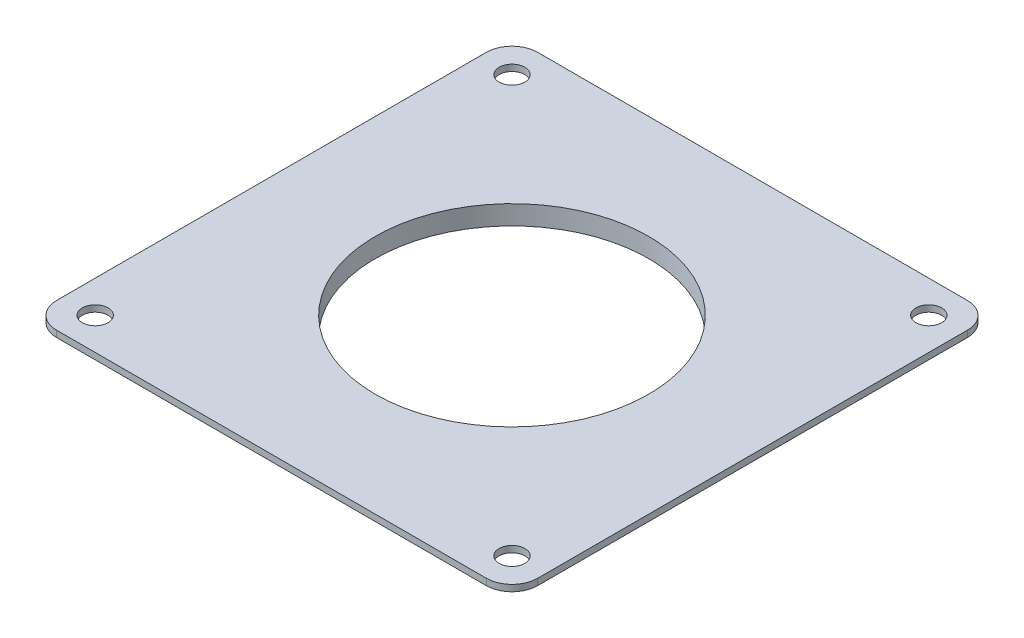
ISO-10303-21;
HEADER;
FILE_DESCRIPTION(('STEP AP214'),'2;1');
FILE_NAME('part.step','',(''),(''),'','','');
FILE_SCHEMA(('AUTOMOTIVE_DESIGN { 1 0 10303 214 1 1 1 1 }'));
ENDSEC;
DATA;
#1=APPLICATION_CONTEXT('core data for automotive mechanical design processes');
#2=APPLICATION_PROTOCOL_DEFINITION('international standard','automotive_design',2000,#1);
#3=PRODUCT_CONTEXT('',#1,'mechanical');
#4=PRODUCT('Part','Part','',(#3));
#5=PRODUCT_RELATED_PRODUCT_CATEGORY('part','',(#4));
#6=PRODUCT_DEFINITION_FORMATION('','',#4);
#7=PRODUCT_DEFINITION_CONTEXT('part definition',#1,'design');
#8=PRODUCT_DEFINITION('design','',#6,#7);
#9=PRODUCT_DEFINITION_SHAPE('','',#8);
#10=(LENGTH_UNIT() NAMED_UNIT(*) SI_UNIT(.MILLI.,.METRE.));
#11=(NAMED_UNIT(*) PLANE_ANGLE_UNIT() SI_UNIT($,.RADIAN.));
#12=(NAMED_UNIT(*) SI_UNIT($,.STERADIAN.) SOLID_ANGLE_UNIT());
#13=UNCERTAINTY_MEASURE_WITH_UNIT(LENGTH_MEASURE(1.E-05),#10,'distance_accuracy_value','');
#14=(GEOMETRIC_REPRESENTATION_CONTEXT(3) GLOBAL_UNCERTAINTY_ASSIGNED_CONTEXT((#13)) GLOBAL_UNIT_ASSIGNED_CONTEXT((#10,
#11,#12)) REPRESENTATION_CONTEXT('',''));
#15=CARTESIAN_POINT('',(0.,0.,0.));
#16=DIRECTION('',(0.,0.,1.));
#17=DIRECTION('',(1.,0.,0.));
#18=AXIS2_PLACEMENT_3D('',#15,#16,#17);
#19=CARTESIAN_POINT('',(-42.42,1.27,42.42));
#20=DIRECTION('',(0.,-1.,0.));
#21=DIRECTION('',(0.,0.,-1.));
#22=AXIS2_PLACEMENT_3D('',#19,#20,#21);
#23=CYLINDRICAL_SURFACE('',#22,5.08);
#24=CARTESIAN_POINT('',(-42.42,0.,42.42));
#25=DIRECTION('',(0.,1.,0.));
#26=DIRECTION('',(0.,0.,-1.));
#27=AXIS2_PLACEMENT_3D('',#24,#25,#26);
#28=CIRCLE('',#27,5.08);
#29=CARTESIAN_POINT('',(-47.5,0.,42.42));
#30=VERTEX_POINT('',#29);
#31=CARTESIAN_POINT('',(-42.42,0.,47.5));
#32=VERTEX_POINT('',#31);
#33=EDGE_CURVE('E150',#30,#32,#28,.T.);
#34=ORIENTED_EDGE('',*,*,#33,.T.);
#35=DIRECTION('',(0.,-1.,0.));
#36=VECTOR('',#35,1.);
#37=CARTESIAN_POINT('',(-42.42,1.27,47.5));
#38=LINE('',#37,#36);
#39=CARTESIAN_POINT('',(-42.42,1.27,47.5));
#40=VERTEX_POINT('',#39);
#41=EDGE_CURVE('E56',#40,#32,#38,.T.);
#42=ORIENTED_EDGE('',*,*,#41,.F.);
#43=CARTESIAN_POINT('',(-42.42,1.27,42.42));
#44=DIRECTION('',(0.,1.,0.));
#45=DIRECTION('',(0.,0.,-1.));
#46=AXIS2_PLACEMENT_3D('',#43,#44,#45);
#47=CIRCLE('',#46,5.08);
#48=CARTESIAN_POINT('',(-47.5,1.27,42.42));
#49=VERTEX_POINT('',#48);
#50=EDGE_CURVE('E173',#49,#40,#47,.T.);
#51=ORIENTED_EDGE('',*,*,#50,.F.);
#52=DIRECTION('',(0.,-1.,0.));
#53=VECTOR('',#52,1.);
#54=CARTESIAN_POINT('',(-47.5,1.27,42.42));
#55=LINE('',#54,#53);
#56=EDGE_CURVE('E146',#49,#30,#55,.T.);
#57=ORIENTED_EDGE('',*,*,#56,.T.);
#58=EDGE_LOOP('',(#34,#42,#51,#57));
#59=FACE_BOUND('',#58,.T.);
#60=ADVANCED_FACE('F45',(#59),#23,.T.);
#61=CARTESIAN_POINT('',(-42.42,1.27,47.5));
#62=DIRECTION('',(0.,0.,-1.));
#63=DIRECTION('',(-1.,0.,0.));
#64=AXIS2_PLACEMENT_3D('',#61,#62,#63);
#65=PLANE('',#64);
#66=DIRECTION('',(1.,0.,0.));
#67=VECTOR('',#66,1.);
#68=CARTESIAN_POINT('',(-42.42,0.,47.5));
#69=LINE('',#68,#67);
#70=CARTESIAN_POINT('',(42.42,0.,47.5));
#71=VERTEX_POINT('',#70);
#72=EDGE_CURVE('E154',#32,#71,#69,.T.);
#73=ORIENTED_EDGE('',*,*,#72,.T.);
#74=DIRECTION('',(0.,-1.,0.));
#75=VECTOR('',#74,1.);
#76=CARTESIAN_POINT('',(42.42,1.27,47.5));
#77=LINE('',#76,#75);
#78=CARTESIAN_POINT('',(42.42,1.27,47.5));
#79=VERTEX_POINT('',#78);
#80=EDGE_CURVE('E188',#79,#71,#77,.T.);
#81=ORIENTED_EDGE('',*,*,#80,.F.);
#82=DIRECTION('',(1.,0.,0.));
#83=VECTOR('',#82,1.);
#84=CARTESIAN_POINT('',(-42.42,1.27,47.5));
#85=LINE('',#84,#83);
#86=EDGE_CURVE('E109',#40,#79,#85,.T.);
#87=ORIENTED_EDGE('',*,*,#86,.F.);
#88=ORIENTED_EDGE('',*,*,#41,.T.);
#89=EDGE_LOOP('',(#73,#81,#87,#88));
#90=FACE_BOUND('',#89,.T.);
#91=ADVANCED_FACE('F266',(#90),#65,.F.);
#92=CARTESIAN_POINT('',(42.42,1.27,42.42));
#93=DIRECTION('',(0.,-1.,0.));
#94=DIRECTION('',(0.,0.,-1.));
#95=AXIS2_PLACEMENT_3D('',#92,#93,#94);
#96=CYLINDRICAL_SURFACE('',#95,5.08);
#97=CARTESIAN_POINT('',(42.42,0.,42.42));
#98=DIRECTION('',(0.,1.,0.));
#99=DIRECTION('',(0.,0.,1.));
#100=AXIS2_PLACEMENT_3D('',#97,#98,#99);
#101=CIRCLE('',#100,5.08);
#102=CARTESIAN_POINT('',(47.5,0.,42.42));
#103=VERTEX_POINT('',#102);
#104=EDGE_CURVE('E158',#71,#103,#101,.T.);
#105=ORIENTED_EDGE('',*,*,#104,.T.);
#106=DIRECTION('',(0.,-1.,0.));
#107=VECTOR('',#106,1.);
#108=CARTESIAN_POINT('',(47.5,1.27,42.42));
#109=LINE('',#108,#107);
#110=CARTESIAN_POINT('',(47.5,1.27,42.42));
#111=VERTEX_POINT('',#110);
#112=EDGE_CURVE('E184',#111,#103,#109,.T.);
#113=ORIENTED_EDGE('',*,*,#112,.F.);
#114=CARTESIAN_POINT('',(42.42,1.27,42.42));
#115=DIRECTION('',(0.,1.,0.));
#116=DIRECTION('',(0.,0.,1.));
#117=AXIS2_PLACEMENT_3D('',#114,#115,#116);
#118=CIRCLE('',#117,5.08);
#119=EDGE_CURVE('E230',#79,#111,#118,.T.);
#120=ORIENTED_EDGE('',*,*,#119,.F.);
#121=ORIENTED_EDGE('',*,*,#80,.T.);
#122=EDGE_LOOP('',(#105,#113,#120,#121));
#123=FACE_BOUND('',#122,.T.);
#124=ADVANCED_FACE('F270',(#123),#96,.T.);
#125=CARTESIAN_POINT('',(47.5,1.27,42.42));
#126=DIRECTION('',(-1.,0.,0.));
#127=DIRECTION('',(0.,0.,1.));
#128=AXIS2_PLACEMENT_3D('',#125,#126,#127);
#129=PLANE('',#128);
#130=DIRECTION('',(0.,0.,-1.));
#131=VECTOR('',#130,1.);
#132=CARTESIAN_POINT('',(47.5,0.,42.42));
#133=LINE('',#132,#131);
#134=CARTESIAN_POINT('',(47.5,0.,-42.42));
#135=VERTEX_POINT('',#134);
#136=EDGE_CURVE('E161',#103,#135,#133,.T.);
#137=ORIENTED_EDGE('',*,*,#136,.T.);
#138=DIRECTION('',(0.,-1.,0.));
#139=VECTOR('',#138,1.);
#140=CARTESIAN_POINT('',(47.5,1.27,-42.42));
#141=LINE('',#140,#139);
#142=CARTESIAN_POINT('',(47.5,1.27,-42.42));
#143=VERTEX_POINT('',#142);
#144=EDGE_CURVE('E180',#143,#135,#141,.T.);
#145=ORIENTED_EDGE('',*,*,#144,.F.);
#146=DIRECTION('',(0.,0.,-1.));
#147=VECTOR('',#146,1.);
#148=CARTESIAN_POINT('',(47.5,1.27,42.42));
#149=LINE('',#148,#147);
#150=EDGE_CURVE('E233',#111,#143,#149,.T.);
#151=ORIENTED_EDGE('',*,*,#150,.F.);
#152=ORIENTED_EDGE('',*,*,#112,.T.);
#153=EDGE_LOOP('',(#137,#145,#151,#152));
#154=FACE_BOUND('',#153,.T.);
#155=ADVANCED_FACE('F241',(#154),#129,.F.);
#156=CARTESIAN_POINT('',(42.42,1.27,-42.42));
#157=DIRECTION('',(0.,-1.,0.));
#158=DIRECTION('',(0.,0.,-1.));
#159=AXIS2_PLACEMENT_3D('',#156,#157,#158);
#160=CYLINDRICAL_SURFACE('',#159,5.08);
#161=CARTESIAN_POINT('',(42.42,0.,-42.42));
#162=DIRECTION('',(0.,1.,0.));
#163=DIRECTION('',(0.,0.,-1.));
#164=AXIS2_PLACEMENT_3D('',#161,#162,#163);
#165=CIRCLE('',#164,5.08);
#166=CARTESIAN_POINT('',(42.42,0.,-47.5));
#167=VERTEX_POINT('',#166);
#168=EDGE_CURVE('E164',#135,#167,#165,.T.);
#169=ORIENTED_EDGE('',*,*,#168,.T.);
#170=DIRECTION('',(0.,-1.,0.));
#171=VECTOR('',#170,1.);
#172=CARTESIAN_POINT('',(42.42,1.27,-47.5));
#173=LINE('',#172,#171);
#174=CARTESIAN_POINT('',(42.42,1.27,-47.5));
#175=VERTEX_POINT('',#174);
#176=EDGE_CURVE('E139',#175,#167,#173,.T.);
#177=ORIENTED_EDGE('',*,*,#176,.F.);
#178=CARTESIAN_POINT('',(42.42,1.27,-42.42));
#179=DIRECTION('',(0.,1.,0.));
#180=DIRECTION('',(0.,0.,-1.));
#181=AXIS2_PLACEMENT_3D('',#178,#179,#180);
#182=CIRCLE('',#181,5.08);
#183=EDGE_CURVE('E128',#143,#175,#182,.T.);
#184=ORIENTED_EDGE('',*,*,#183,.F.);
#185=ORIENTED_EDGE('',*,*,#144,.T.);
#186=EDGE_LOOP('',(#169,#177,#184,#185));
#187=FACE_BOUND('',#186,.T.);
#188=ADVANCED_FACE('F245',(#187),#160,.T.);
#189=CARTESIAN_POINT('',(-42.42,1.27,-47.5));
#190=DIRECTION('',(0.,0.,1.));
#191=DIRECTION('',(1.,0.,0.));
#192=AXIS2_PLACEMENT_3D('',#189,#190,#191);
#193=PLANE('',#192);
#194=DIRECTION('',(-1.,0.,0.));
#195=VECTOR('',#194,1.);
#196=CARTESIAN_POINT('',(-42.42,0.,-47.5));
#197=LINE('',#196,#195);
#198=CARTESIAN_POINT('',(-42.42,0.,-47.5));
#199=VERTEX_POINT('',#198);
#200=EDGE_CURVE('E137',#167,#199,#197,.T.);
#201=ORIENTED_EDGE('',*,*,#200,.T.);
#202=DIRECTION('',(0.,-1.,0.));
#203=VECTOR('',#202,1.);
#204=CARTESIAN_POINT('',(-42.42,1.27,-47.5));
#205=LINE('',#204,#203);
#206=CARTESIAN_POINT('',(-42.42,1.27,-47.5));
#207=VERTEX_POINT('',#206);
#208=EDGE_CURVE('E134',#207,#199,#205,.T.);
#209=ORIENTED_EDGE('',*,*,#208,.F.);
#210=DIRECTION('',(-1.,0.,0.));
#211=VECTOR('',#210,1.);
#212=CARTESIAN_POINT('',(-42.42,1.27,-47.5));
#213=LINE('',#212,#211);
#214=EDGE_CURVE('E122',#175,#207,#213,.T.);
#215=ORIENTED_EDGE('',*,*,#214,.F.);
#216=ORIENTED_EDGE('',*,*,#176,.T.);
#217=EDGE_LOOP('',(#201,#209,#215,#216));
#218=FACE_BOUND('',#217,.T.);
#219=ADVANCED_FACE('F135',(#218),#193,.F.);
#220=CARTESIAN_POINT('',(-42.42,1.27,-42.42));
#221=DIRECTION('',(0.,-1.,0.));
#222=DIRECTION('',(0.,0.,-1.));
#223=AXIS2_PLACEMENT_3D('',#220,#221,#222);
#224=CYLINDRICAL_SURFACE('',#223,5.08);
#225=CARTESIAN_POINT('',(-42.42,0.,-42.42));
#226=DIRECTION('',(0.,1.,0.));
#227=DIRECTION('',(0.,0.,-1.));
#228=AXIS2_PLACEMENT_3D('',#225,#226,#227);
#229=CIRCLE('',#228,5.08);
#230=CARTESIAN_POINT('',(-47.5,0.,-42.42));
#231=VERTEX_POINT('',#230);
#232=EDGE_CURVE('E94',#199,#231,#229,.T.);
#233=ORIENTED_EDGE('',*,*,#232,.T.);
#234=DIRECTION('',(0.,-1.,0.));
#235=VECTOR('',#234,1.);
#236=CARTESIAN_POINT('',(-47.5,1.27,-42.42));
#237=LINE('',#236,#235);
#238=CARTESIAN_POINT('',(-47.5,1.27,-42.42));
#239=VERTEX_POINT('',#238);
#240=EDGE_CURVE('E140',#239,#231,#237,.T.);
#241=ORIENTED_EDGE('',*,*,#240,.F.);
#242=CARTESIAN_POINT('',(-42.42,1.27,-42.42));
#243=DIRECTION('',(0.,1.,0.));
#244=DIRECTION('',(0.,0.,-1.));
#245=AXIS2_PLACEMENT_3D('',#242,#243,#244);
#246=CIRCLE('',#245,5.08);
#247=EDGE_CURVE('E126',#207,#239,#246,.T.);
#248=ORIENTED_EDGE('',*,*,#247,.F.);
#249=ORIENTED_EDGE('',*,*,#208,.T.);
#250=EDGE_LOOP('',(#233,#241,#248,#249));
#251=FACE_BOUND('',#250,.T.);
#252=ADVANCED_FACE('F142',(#251),#224,.T.);
#253=CARTESIAN_POINT('',(-47.5,1.27,42.42));
#254=DIRECTION('',(1.,0.,0.));
#255=DIRECTION('',(0.,0.,-1.));
#256=AXIS2_PLACEMENT_3D('',#253,#254,#255);
#257=PLANE('',#256);
#258=DIRECTION('',(0.,0.,1.));
#259=VECTOR('',#258,1.);
#260=CARTESIAN_POINT('',(-47.5,0.,42.42));
#261=LINE('',#260,#259);
#262=EDGE_CURVE('E100',#231,#30,#261,.T.);
#263=ORIENTED_EDGE('',*,*,#262,.T.);
#264=ORIENTED_EDGE('',*,*,#56,.F.);
#265=DIRECTION('',(0.,0.,1.));
#266=VECTOR('',#265,1.);
#267=CARTESIAN_POINT('',(-47.5,1.27,42.42));
#268=LINE('',#267,#266);
#269=EDGE_CURVE('E65',#239,#49,#268,.T.);
#270=ORIENTED_EDGE('',*,*,#269,.F.);
#271=ORIENTED_EDGE('',*,*,#240,.T.);
#272=EDGE_LOOP('',(#263,#264,#270,#271));
#273=FACE_BOUND('',#272,.T.);
#274=ADVANCED_FACE('F253',(#273),#257,.F.);
#275=CARTESIAN_POINT('',(-42.42,1.27,42.42));
#276=DIRECTION('',(0.,-1.,0.));
#277=DIRECTION('',(0.,0.,-1.));
#278=AXIS2_PLACEMENT_3D('',#275,#276,#277);
#279=PLANE('',#278);
#280=CARTESIAN_POINT('',(41.15,1.27,-41.15));
#281=DIRECTION('',(0.,1.,0.));
#282=DIRECTION('',(0.,0.,-1.));
#283=AXIS2_PLACEMENT_3D('',#280,#281,#282);
#284=CIRCLE('',#283,2.54);
#285=CARTESIAN_POINT('',(41.15,1.27,-43.69));
#286=VERTEX_POINT('',#285);
#287=EDGE_CURVE('E380',#286,#286,#284,.T.);
#288=ORIENTED_EDGE('',*,*,#287,.F.);
#289=EDGE_LOOP('',(#288));
#290=FACE_BOUND('',#289,.T.);
#291=CARTESIAN_POINT('',(-41.15,1.27,41.15));
#292=DIRECTION('',(0.,1.,0.));
#293=DIRECTION('',(0.,0.,-1.));
#294=AXIS2_PLACEMENT_3D('',#291,#292,#293);
#295=CIRCLE('',#294,2.54);
#296=CARTESIAN_POINT('',(-41.15,1.27,38.61));
#297=VERTEX_POINT('',#296);
#298=EDGE_CURVE('E382',#297,#297,#295,.T.);
#299=ORIENTED_EDGE('',*,*,#298,.F.);
#300=EDGE_LOOP('',(#299));
#301=FACE_BOUND('',#300,.T.);
#302=CARTESIAN_POINT('',(41.15,1.27,41.15));
#303=DIRECTION('',(0.,1.,0.));
#304=DIRECTION('',(0.,0.,1.));
#305=AXIS2_PLACEMENT_3D('',#302,#303,#304);
#306=CIRCLE('',#305,2.54);
#307=CARTESIAN_POINT('',(41.15,1.27,43.69));
#308=VERTEX_POINT('',#307);
#309=EDGE_CURVE('E388',#308,#308,#306,.T.);
#310=ORIENTED_EDGE('',*,*,#309,.F.);
#311=EDGE_LOOP('',(#310));
#312=FACE_BOUND('',#311,.T.);
#313=CARTESIAN_POINT('',(-41.15,1.27,-41.15));
#314=DIRECTION('',(0.,1.,0.));
#315=DIRECTION('',(0.,0.,1.));
#316=AXIS2_PLACEMENT_3D('',#313,#314,#315);
#317=CIRCLE('',#316,2.54);
#318=CARTESIAN_POINT('',(-41.15,1.27,-38.61));
#319=VERTEX_POINT('',#318);
#320=EDGE_CURVE('E199',#319,#319,#317,.T.);
#321=ORIENTED_EDGE('',*,*,#320,.F.);
#322=EDGE_LOOP('',(#321));
#323=FACE_BOUND('',#322,.T.);
#324=CARTESIAN_POINT('',(0.,1.27,0.));
#325=DIRECTION('',(0.,1.,0.));
#326=DIRECTION('',(0.,0.,1.));
#327=AXIS2_PLACEMENT_3D('',#324,#325,#326);
#328=CIRCLE('',#327,27.);
#329=CARTESIAN_POINT('',(0.,1.27,27.));
#330=VERTEX_POINT('',#329);
#331=EDGE_CURVE('E209',#330,#330,#328,.T.);
#332=ORIENTED_EDGE('',*,*,#331,.F.);
#333=EDGE_LOOP('',(#332));
#334=FACE_BOUND('',#333,.T.);
#335=ORIENTED_EDGE('',*,*,#50,.T.);
#336=ORIENTED_EDGE('',*,*,#86,.T.);
#337=ORIENTED_EDGE('',*,*,#119,.T.);
#338=ORIENTED_EDGE('',*,*,#150,.T.);
#339=ORIENTED_EDGE('',*,*,#183,.T.);
#340=ORIENTED_EDGE('',*,*,#214,.T.);
#341=ORIENTED_EDGE('',*,*,#247,.T.);
#342=ORIENTED_EDGE('',*,*,#269,.T.);
#343=EDGE_LOOP('',(#335,#336,#337,#338,#339,#340,#341,#342));
#344=FACE_BOUND('',#343,.T.);
#345=ADVANCED_FACE('F124',(#290,#301,#312,#323,#334,#344),#279,.F.);
#346=CARTESIAN_POINT('',(-42.42,0.,42.42));
#347=DIRECTION('',(0.,-1.,0.));
#348=DIRECTION('',(0.,0.,-1.));
#349=AXIS2_PLACEMENT_3D('',#346,#347,#348);
#350=PLANE('',#349);
#351=CARTESIAN_POINT('',(41.15,0.,-41.15));
#352=DIRECTION('',(0.,-1.,0.));
#353=DIRECTION('',(0.,0.,-1.));
#354=AXIS2_PLACEMENT_3D('',#351,#352,#353);
#355=CIRCLE('',#354,2.54);
#356=CARTESIAN_POINT('',(41.15,0.,-43.69));
#357=VERTEX_POINT('',#356);
#358=EDGE_CURVE('E49',#357,#357,#355,.T.);
#359=ORIENTED_EDGE('',*,*,#358,.F.);
#360=EDGE_LOOP('',(#359));
#361=FACE_BOUND('',#360,.T.);
#362=CARTESIAN_POINT('',(-41.15,0.,41.15));
#363=DIRECTION('',(0.,-1.,0.));
#364=DIRECTION('',(0.,0.,-1.));
#365=AXIS2_PLACEMENT_3D('',#362,#363,#364);
#366=CIRCLE('',#365,2.54);
#367=CARTESIAN_POINT('',(-41.15,0.,38.61));
#368=VERTEX_POINT('',#367);
#369=EDGE_CURVE('E202',#368,#368,#366,.T.);
#370=ORIENTED_EDGE('',*,*,#369,.F.);
#371=EDGE_LOOP('',(#370));
#372=FACE_BOUND('',#371,.T.);
#373=CARTESIAN_POINT('',(41.15,0.,41.15));
#374=DIRECTION('',(0.,-1.,0.));
#375=DIRECTION('',(0.,0.,-1.));
#376=AXIS2_PLACEMENT_3D('',#373,#374,#375);
#377=CIRCLE('',#376,2.54);
#378=CARTESIAN_POINT('',(41.15,0.,38.61));
#379=VERTEX_POINT('',#378);
#380=EDGE_CURVE('E198',#379,#379,#377,.T.);
#381=ORIENTED_EDGE('',*,*,#380,.F.);
#382=EDGE_LOOP('',(#381));
#383=FACE_BOUND('',#382,.T.);
#384=CARTESIAN_POINT('',(-41.15,0.,-41.15));
#385=DIRECTION('',(0.,-1.,0.));
#386=DIRECTION('',(0.,0.,-1.));
#387=AXIS2_PLACEMENT_3D('',#384,#385,#386);
#388=CIRCLE('',#387,2.54);
#389=CARTESIAN_POINT('',(-41.15,0.,-43.69));
#390=VERTEX_POINT('',#389);
#391=EDGE_CURVE('E194',#390,#390,#388,.T.);
#392=ORIENTED_EDGE('',*,*,#391,.F.);
#393=EDGE_LOOP('',(#392));
#394=FACE_BOUND('',#393,.T.);
#395=CARTESIAN_POINT('',(0.,0.,0.));
#396=DIRECTION('',(0.,-1.,0.));
#397=DIRECTION('',(0.,0.,-1.));
#398=AXIS2_PLACEMENT_3D('',#395,#396,#397);
#399=CIRCLE('',#398,44.8202083301041);
#400=CARTESIAN_POINT('',(0.,0.,-44.8202083301041));
#401=VERTEX_POINT('',#400);
#402=EDGE_CURVE('E11',#401,#401,#399,.F.);
#403=ORIENTED_EDGE('',*,*,#402,.T.);
#404=EDGE_LOOP('',(#403));
#405=FACE_BOUND('',#404,.T.);
#406=ORIENTED_EDGE('',*,*,#33,.F.);
#407=ORIENTED_EDGE('',*,*,#262,.F.);
#408=ORIENTED_EDGE('',*,*,#232,.F.);
#409=ORIENTED_EDGE('',*,*,#200,.F.);
#410=ORIENTED_EDGE('',*,*,#168,.F.);
#411=ORIENTED_EDGE('',*,*,#136,.F.);
#412=ORIENTED_EDGE('',*,*,#104,.F.);
#413=ORIENTED_EDGE('',*,*,#72,.F.);
#414=EDGE_LOOP('',(#406,#407,#408,#409,#410,#411,#412,#413));
#415=FACE_BOUND('',#414,.T.);
#416=ADVANCED_FACE('F248',(#361,#372,#383,#394,#405,#415),#350,.T.);
#417=CARTESIAN_POINT('',(0.,-2.54,0.));
#418=DIRECTION('',(0.,-1.,0.));
#419=DIRECTION('',(0.,0.,-1.));
#420=AXIS2_PLACEMENT_3D('',#417,#418,#419);
#421=PLANE('',#420);
#422=CARTESIAN_POINT('',(0.,-2.54,0.));
#423=DIRECTION('',(0.,1.,0.));
#424=DIRECTION('',(0.,0.,1.));
#425=AXIS2_PLACEMENT_3D('',#422,#423,#424);
#426=CIRCLE('',#425,27.);
#427=CARTESIAN_POINT('',(0.,-2.54,27.));
#428=VERTEX_POINT('',#427);
#429=EDGE_CURVE('E214',#428,#428,#426,.T.);
#430=ORIENTED_EDGE('',*,*,#429,.T.);
#431=EDGE_LOOP('',(#430));
#432=FACE_BOUND('',#431,.T.);
#433=CARTESIAN_POINT('',(0.,-2.54,0.));
#434=DIRECTION('',(0.,-1.,0.));
#435=DIRECTION('',(0.,0.,-1.));
#436=AXIS2_PLACEMENT_3D('',#433,#434,#435);
#437=CIRCLE('',#436,38.1);
#438=CARTESIAN_POINT('',(0.,-2.54,-38.1));
#439=VERTEX_POINT('',#438);
#440=EDGE_CURVE('E155',#439,#439,#437,.T.);
#441=ORIENTED_EDGE('',*,*,#440,.T.);
#442=EDGE_LOOP('',(#441));
#443=FACE_BOUND('',#442,.T.);
#444=ADVANCED_FACE('F311',(#432,#443),#421,.T.);
#445=CARTESIAN_POINT('',(0.,-10.16,0.));
#446=DIRECTION('',(0.,-1.,0.));
#447=DIRECTION('',(0.,0.,-1.));
#448=AXIS2_PLACEMENT_3D('',#445,#446,#447);
#449=TOROIDAL_SURFACE('',#448,44.8202083301041,10.16);
#450=ORIENTED_EDGE('',*,*,#402,.F.);
#451=EDGE_LOOP('',(#450));
#452=FACE_BOUND('',#451,.T.);
#453=ORIENTED_EDGE('',*,*,#440,.F.);
#454=EDGE_LOOP('',(#453));
#455=FACE_BOUND('',#454,.T.);
#456=ADVANCED_FACE('F47',(#452,#455),#449,.F.);
#457=CARTESIAN_POINT('',(0.,-2.54,0.));
#458=DIRECTION('',(0.,1.,0.));
#459=DIRECTION('',(0.,0.,1.));
#460=AXIS2_PLACEMENT_3D('',#457,#458,#459);
#461=CYLINDRICAL_SURFACE('',#460,27.);
#462=ORIENTED_EDGE('',*,*,#429,.F.);
#463=EDGE_LOOP('',(#462));
#464=FACE_BOUND('',#463,.T.);
#465=ORIENTED_EDGE('',*,*,#331,.T.);
#466=EDGE_LOOP('',(#465));
#467=FACE_BOUND('',#466,.T.);
#468=ADVANCED_FACE('F329',(#464,#467),#461,.F.);
#469=CARTESIAN_POINT('',(-41.15,-2.54,-41.15));
#470=DIRECTION('',(0.,1.,0.));
#471=DIRECTION('',(0.,0.,1.));
#472=AXIS2_PLACEMENT_3D('',#469,#470,#471);
#473=CYLINDRICAL_SURFACE('',#472,2.54);
#474=ORIENTED_EDGE('',*,*,#391,.T.);
#475=EDGE_LOOP('',(#474));
#476=FACE_BOUND('',#475,.T.);
#477=ORIENTED_EDGE('',*,*,#320,.T.);
#478=EDGE_LOOP('',(#477));
#479=FACE_BOUND('',#478,.T.);
#480=ADVANCED_FACE('F337',(#476,#479),#473,.F.);
#481=CARTESIAN_POINT('',(41.15,-2.54,41.15));
#482=DIRECTION('',(0.,1.,0.));
#483=DIRECTION('',(0.,0.,1.));
#484=AXIS2_PLACEMENT_3D('',#481,#482,#483);
#485=CYLINDRICAL_SURFACE('',#484,2.54);
#486=ORIENTED_EDGE('',*,*,#380,.T.);
#487=EDGE_LOOP('',(#486));
#488=FACE_BOUND('',#487,.T.);
#489=ORIENTED_EDGE('',*,*,#309,.T.);
#490=EDGE_LOOP('',(#489));
#491=FACE_BOUND('',#490,.T.);
#492=ADVANCED_FACE('F346',(#488,#491),#485,.F.);
#493=CARTESIAN_POINT('',(-41.15,-2.54,41.15));
#494=DIRECTION('',(0.,1.,0.));
#495=DIRECTION('',(0.,0.,1.));
#496=AXIS2_PLACEMENT_3D('',#493,#494,#495);
#497=CYLINDRICAL_SURFACE('',#496,2.54);
#498=ORIENTED_EDGE('',*,*,#369,.T.);
#499=EDGE_LOOP('',(#498));
#500=FACE_BOUND('',#499,.T.);
#501=ORIENTED_EDGE('',*,*,#298,.T.);
#502=EDGE_LOOP('',(#501));
#503=FACE_BOUND('',#502,.T.);
#504=ADVANCED_FACE('F356',(#500,#503),#497,.F.);
#505=CARTESIAN_POINT('',(41.15,-2.54,-41.15));
#506=DIRECTION('',(0.,1.,0.));
#507=DIRECTION('',(0.,0.,1.));
#508=AXIS2_PLACEMENT_3D('',#505,#506,#507);
#509=CYLINDRICAL_SURFACE('',#508,2.54);
#510=ORIENTED_EDGE('',*,*,#358,.T.);
#511=EDGE_LOOP('',(#510));
#512=FACE_BOUND('',#511,.T.);
#513=ORIENTED_EDGE('',*,*,#287,.T.);
#514=EDGE_LOOP('',(#513));
#515=FACE_BOUND('',#514,.T.);
#516=ADVANCED_FACE('F366',(#512,#515),#509,.F.);
#517=CLOSED_SHELL('',(#60,#91,#124,#155,#188,#219,#252,#274,#345,#416,#444,#456,#468,#480,#492,
#504,#516));
#518=MANIFOLD_SOLID_BREP('B2',#517);
#519=ADVANCED_BREP_SHAPE_REPRESENTATION('',(#18,#518),#14);
#520=SHAPE_DEFINITION_REPRESENTATION(#9,#519);
ENDSEC;
END-ISO-10303-21;
